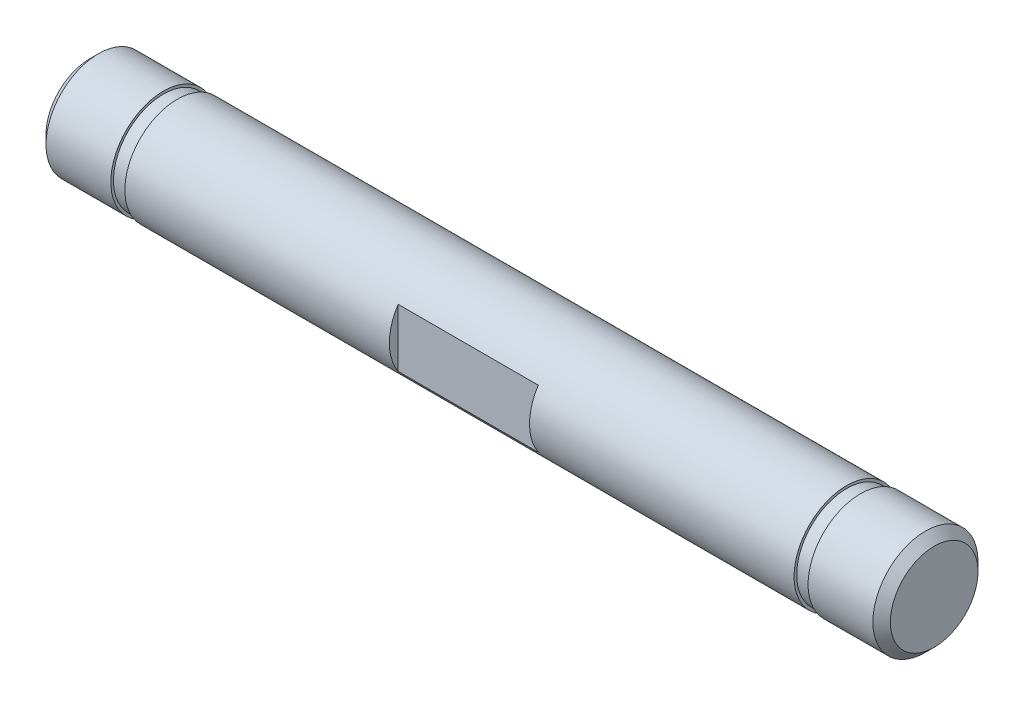
ISO-10303-21;
HEADER;
FILE_DESCRIPTION(('STEP AP214'),'2;1');
FILE_NAME('part.step','',(''),(''),'','','');
FILE_SCHEMA(('AUTOMOTIVE_DESIGN { 1 0 10303 214 1 1 1 1 }'));
ENDSEC;
DATA;
#1=APPLICATION_CONTEXT('core data for automotive mechanical design processes');
#2=APPLICATION_PROTOCOL_DEFINITION('international standard','automotive_design',2000,#1);
#3=PRODUCT_CONTEXT('',#1,'mechanical');
#4=PRODUCT('Part','Part','',(#3));
#5=PRODUCT_RELATED_PRODUCT_CATEGORY('part','',(#4));
#6=PRODUCT_DEFINITION_FORMATION('','',#4);
#7=PRODUCT_DEFINITION_CONTEXT('part definition',#1,'design');
#8=PRODUCT_DEFINITION('design','',#6,#7);
#9=PRODUCT_DEFINITION_SHAPE('','',#8);
#10=(LENGTH_UNIT() NAMED_UNIT(*) SI_UNIT(.MILLI.,.METRE.));
#11=(NAMED_UNIT(*) PLANE_ANGLE_UNIT() SI_UNIT($,.RADIAN.));
#12=(NAMED_UNIT(*) SI_UNIT($,.STERADIAN.) SOLID_ANGLE_UNIT());
#13=UNCERTAINTY_MEASURE_WITH_UNIT(LENGTH_MEASURE(1.E-05),#10,'distance_accuracy_value','');
#14=(GEOMETRIC_REPRESENTATION_CONTEXT(3) GLOBAL_UNCERTAINTY_ASSIGNED_CONTEXT((#13)) GLOBAL_UNIT_ASSIGNED_CONTEXT((#10,
#11,#12)) REPRESENTATION_CONTEXT('',''));
#15=CARTESIAN_POINT('',(0.,0.,0.));
#16=DIRECTION('',(0.,0.,1.));
#17=DIRECTION('',(1.,0.,0.));
#18=AXIS2_PLACEMENT_3D('',#15,#16,#17);
#19=CARTESIAN_POINT('',(24.1,0.,0.));
#20=DIRECTION('',(1.,0.,0.));
#21=DIRECTION('',(0.,0.,-1.));
#22=AXIS2_PLACEMENT_3D('',#19,#20,#21);
#23=CYLINDRICAL_SURFACE('',#22,3.);
#24=CARTESIAN_POINT('',(-19.1,0.,0.));
#25=DIRECTION('',(1.,0.,0.));
#26=DIRECTION('',(0.,0.,-1.));
#27=AXIS2_PLACEMENT_3D('',#24,#25,#26);
#28=CIRCLE('',#27,3.);
#29=CARTESIAN_POINT('',(-19.1,0.,-3.));
#30=VERTEX_POINT('',#29);
#31=EDGE_CURVE('E97',#30,#30,#28,.T.);
#32=ORIENTED_EDGE('',*,*,#31,.T.);
#33=EDGE_LOOP('',(#32));
#34=FACE_BOUND('',#33,.T.);
#35=CARTESIAN_POINT('',(19.1,0.,0.));
#36=DIRECTION('',(1.,0.,0.));
#37=DIRECTION('',(0.,0.,-1.));
#38=AXIS2_PLACEMENT_3D('',#35,#36,#37);
#39=CIRCLE('',#38,3.);
#40=CARTESIAN_POINT('',(19.1,0.,-3.));
#41=VERTEX_POINT('',#40);
#42=EDGE_CURVE('E100',#41,#41,#39,.T.);
#43=ORIENTED_EDGE('',*,*,#42,.F.);
#44=EDGE_LOOP('',(#43));
#45=FACE_BOUND('',#44,.T.);
#46=CARTESIAN_POINT('',(-4.,0.,0.));
#47=DIRECTION('',(1.,0.,0.));
#48=DIRECTION('',(0.,0.,-1.));
#49=AXIS2_PLACEMENT_3D('',#46,#47,#48);
#50=CIRCLE('',#49,3.);
#51=CARTESIAN_POINT('',(-4.,1.6583123951777,2.5));
#52=VERTEX_POINT('',#51);
#53=CARTESIAN_POINT('',(-4.,-1.6583123951777,2.5));
#54=VERTEX_POINT('',#53);
#55=EDGE_CURVE('E81',#52,#54,#50,.T.);
#56=ORIENTED_EDGE('',*,*,#55,.F.);
#57=DIRECTION('',(1.,0.,0.));
#58=VECTOR('',#57,1.);
#59=CARTESIAN_POINT('',(-4.,1.6583123951777,2.5));
#60=LINE('',#59,#58);
#61=CARTESIAN_POINT('',(4.,1.6583123951777,2.5));
#62=VERTEX_POINT('',#61);
#63=EDGE_CURVE('E68',#52,#62,#60,.T.);
#64=ORIENTED_EDGE('',*,*,#63,.T.);
#65=CARTESIAN_POINT('',(4.,0.,0.));
#66=DIRECTION('',(1.,0.,0.));
#67=DIRECTION('',(0.,0.,-1.));
#68=AXIS2_PLACEMENT_3D('',#65,#66,#67);
#69=CIRCLE('',#68,3.);
#70=CARTESIAN_POINT('',(4.,-1.6583123951777,2.5));
#71=VERTEX_POINT('',#70);
#72=EDGE_CURVE('E74',#62,#71,#69,.T.);
#73=ORIENTED_EDGE('',*,*,#72,.T.);
#74=DIRECTION('',(1.,0.,0.));
#75=VECTOR('',#74,1.);
#76=CARTESIAN_POINT('',(-4.,-1.6583123951777,2.5));
#77=LINE('',#76,#75);
#78=EDGE_CURVE('E80',#54,#71,#77,.T.);
#79=ORIENTED_EDGE('',*,*,#78,.F.);
#80=EDGE_LOOP('',(#56,#64,#73,#79));
#81=FACE_BOUND('',#80,.T.);
#82=ADVANCED_FACE('F45',(#34,#45,#81),#23,.T.);
#83=CARTESIAN_POINT('',(24.1,0.,3.));
#84=DIRECTION('',(-1.,0.,0.));
#85=DIRECTION('',(0.,0.,1.));
#86=AXIS2_PLACEMENT_3D('',#83,#84,#85);
#87=PLANE('',#86);
#88=CARTESIAN_POINT('',(24.1,0.,0.));
#89=DIRECTION('',(-1.,0.,0.));
#90=DIRECTION('',(0.,0.,1.));
#91=AXIS2_PLACEMENT_3D('',#88,#89,#90);
#92=CIRCLE('',#91,2.49999999999999);
#93=CARTESIAN_POINT('',(24.1,0.,2.49999999999999));
#94=VERTEX_POINT('',#93);
#95=EDGE_CURVE('E54',#94,#94,#92,.F.);
#96=ORIENTED_EDGE('',*,*,#95,.T.);
#97=EDGE_LOOP('',(#96));
#98=FACE_BOUND('',#97,.T.);
#99=ADVANCED_FACE('F120',(#98),#87,.F.);
#100=CARTESIAN_POINT('',(24.1,0.,0.));
#101=DIRECTION('',(1.,0.,0.));
#102=DIRECTION('',(0.,0.,-1.));
#103=AXIS2_PLACEMENT_3D('',#100,#101,#102);
#104=CYLINDRICAL_SURFACE('',#103,3.);
#105=CARTESIAN_POINT('',(23.6,0.,0.));
#106=DIRECTION('',(-1.,0.,0.));
#107=DIRECTION('',(0.,0.,1.));
#108=AXIS2_PLACEMENT_3D('',#105,#106,#107);
#109=CIRCLE('',#108,3.);
#110=CARTESIAN_POINT('',(23.6,0.,3.));
#111=VERTEX_POINT('',#110);
#112=EDGE_CURVE('E11',#111,#111,#109,.T.);
#113=ORIENTED_EDGE('',*,*,#112,.T.);
#114=EDGE_LOOP('',(#113));
#115=FACE_BOUND('',#114,.T.);
#116=CARTESIAN_POINT('',(19.9,0.,0.));
#117=DIRECTION('',(1.,0.,0.));
#118=DIRECTION('',(0.,0.,-1.));
#119=AXIS2_PLACEMENT_3D('',#116,#117,#118);
#120=CIRCLE('',#119,3.);
#121=CARTESIAN_POINT('',(19.9,0.,-3.));
#122=VERTEX_POINT('',#121);
#123=EDGE_CURVE('E109',#122,#122,#120,.T.);
#124=ORIENTED_EDGE('',*,*,#123,.T.);
#125=EDGE_LOOP('',(#124));
#126=FACE_BOUND('',#125,.T.);
#127=ADVANCED_FACE('F136',(#115,#126),#104,.T.);
#128=CARTESIAN_POINT('',(19.9,0.,2.85));
#129=DIRECTION('',(1.,0.,0.));
#130=DIRECTION('',(0.,0.,-1.));
#131=AXIS2_PLACEMENT_3D('',#128,#129,#130);
#132=PLANE('',#131);
#133=ORIENTED_EDGE('',*,*,#123,.F.);
#134=EDGE_LOOP('',(#133));
#135=FACE_BOUND('',#134,.T.);
#136=CARTESIAN_POINT('',(19.9,0.,0.));
#137=DIRECTION('',(1.,0.,0.));
#138=DIRECTION('',(0.,0.,-1.));
#139=AXIS2_PLACEMENT_3D('',#136,#137,#138);
#140=CIRCLE('',#139,2.85);
#141=CARTESIAN_POINT('',(19.9,0.,-2.85));
#142=VERTEX_POINT('',#141);
#143=EDGE_CURVE('E106',#142,#142,#140,.T.);
#144=ORIENTED_EDGE('',*,*,#143,.T.);
#145=EDGE_LOOP('',(#144));
#146=FACE_BOUND('',#145,.T.);
#147=ADVANCED_FACE('F150',(#135,#146),#132,.F.);
#148=CARTESIAN_POINT('',(24.1,0.,0.));
#149=DIRECTION('',(1.,0.,0.));
#150=DIRECTION('',(0.,0.,-1.));
#151=AXIS2_PLACEMENT_3D('',#148,#149,#150);
#152=CYLINDRICAL_SURFACE('',#151,2.85);
#153=ORIENTED_EDGE('',*,*,#143,.F.);
#154=EDGE_LOOP('',(#153));
#155=FACE_BOUND('',#154,.T.);
#156=CARTESIAN_POINT('',(19.1,0.,0.));
#157=DIRECTION('',(1.,0.,0.));
#158=DIRECTION('',(0.,0.,-1.));
#159=AXIS2_PLACEMENT_3D('',#156,#157,#158);
#160=CIRCLE('',#159,2.85);
#161=CARTESIAN_POINT('',(19.1,0.,-2.85));
#162=VERTEX_POINT('',#161);
#163=EDGE_CURVE('E103',#162,#162,#160,.T.);
#164=ORIENTED_EDGE('',*,*,#163,.T.);
#165=EDGE_LOOP('',(#164));
#166=FACE_BOUND('',#165,.T.);
#167=ADVANCED_FACE('F146',(#155,#166),#152,.T.);
#168=CARTESIAN_POINT('',(19.1,0.,3.));
#169=DIRECTION('',(-1.,0.,0.));
#170=DIRECTION('',(0.,0.,1.));
#171=AXIS2_PLACEMENT_3D('',#168,#169,#170);
#172=PLANE('',#171);
#173=ORIENTED_EDGE('',*,*,#163,.F.);
#174=EDGE_LOOP('',(#173));
#175=FACE_BOUND('',#174,.T.);
#176=ORIENTED_EDGE('',*,*,#42,.T.);
#177=EDGE_LOOP('',(#176));
#178=FACE_BOUND('',#177,.T.);
#179=ADVANCED_FACE('F143',(#175,#178),#172,.F.);
#180=CARTESIAN_POINT('',(-19.1,0.,3.));
#181=DIRECTION('',(1.,0.,0.));
#182=DIRECTION('',(0.,0.,-1.));
#183=AXIS2_PLACEMENT_3D('',#180,#181,#182);
#184=PLANE('',#183);
#185=ORIENTED_EDGE('',*,*,#31,.F.);
#186=EDGE_LOOP('',(#185));
#187=FACE_BOUND('',#186,.T.);
#188=CARTESIAN_POINT('',(-19.1,0.,0.));
#189=DIRECTION('',(1.,0.,0.));
#190=DIRECTION('',(0.,0.,-1.));
#191=AXIS2_PLACEMENT_3D('',#188,#189,#190);
#192=CIRCLE('',#191,2.85);
#193=CARTESIAN_POINT('',(-19.1,0.,-2.85));
#194=VERTEX_POINT('',#193);
#195=EDGE_CURVE('E94',#194,#194,#192,.T.);
#196=ORIENTED_EDGE('',*,*,#195,.T.);
#197=EDGE_LOOP('',(#196));
#198=FACE_BOUND('',#197,.T.);
#199=ADVANCED_FACE('F141',(#187,#198),#184,.F.);
#200=CARTESIAN_POINT('',(24.1,0.,0.));
#201=DIRECTION('',(1.,0.,0.));
#202=DIRECTION('',(0.,0.,-1.));
#203=AXIS2_PLACEMENT_3D('',#200,#201,#202);
#204=CYLINDRICAL_SURFACE('',#203,2.85);
#205=ORIENTED_EDGE('',*,*,#195,.F.);
#206=EDGE_LOOP('',(#205));
#207=FACE_BOUND('',#206,.T.);
#208=CARTESIAN_POINT('',(-19.9,0.,0.));
#209=DIRECTION('',(1.,0.,0.));
#210=DIRECTION('',(0.,0.,-1.));
#211=AXIS2_PLACEMENT_3D('',#208,#209,#210);
#212=CIRCLE('',#211,2.85);
#213=CARTESIAN_POINT('',(-19.9,0.,-2.85));
#214=VERTEX_POINT('',#213);
#215=EDGE_CURVE('E87',#214,#214,#212,.T.);
#216=ORIENTED_EDGE('',*,*,#215,.T.);
#217=EDGE_LOOP('',(#216));
#218=FACE_BOUND('',#217,.T.);
#219=ADVANCED_FACE('F246',(#207,#218),#204,.T.);
#220=CARTESIAN_POINT('',(-19.9,0.,2.85));
#221=DIRECTION('',(-1.,0.,0.));
#222=DIRECTION('',(0.,0.,1.));
#223=AXIS2_PLACEMENT_3D('',#220,#221,#222);
#224=PLANE('',#223);
#225=ORIENTED_EDGE('',*,*,#215,.F.);
#226=EDGE_LOOP('',(#225));
#227=FACE_BOUND('',#226,.T.);
#228=CARTESIAN_POINT('',(-19.9,0.,0.));
#229=DIRECTION('',(1.,0.,0.));
#230=DIRECTION('',(0.,0.,-1.));
#231=AXIS2_PLACEMENT_3D('',#228,#229,#230);
#232=CIRCLE('',#231,3.);
#233=CARTESIAN_POINT('',(-19.9,0.,-3.));
#234=VERTEX_POINT('',#233);
#235=EDGE_CURVE('E84',#234,#234,#232,.T.);
#236=ORIENTED_EDGE('',*,*,#235,.T.);
#237=EDGE_LOOP('',(#236));
#238=FACE_BOUND('',#237,.T.);
#239=ADVANCED_FACE('F185',(#227,#238),#224,.F.);
#240=CARTESIAN_POINT('',(24.1,0.,0.));
#241=DIRECTION('',(1.,0.,0.));
#242=DIRECTION('',(0.,0.,-1.));
#243=AXIS2_PLACEMENT_3D('',#240,#241,#242);
#244=CYLINDRICAL_SURFACE('',#243,3.);
#245=CARTESIAN_POINT('',(-23.6,0.,0.));
#246=DIRECTION('',(1.,0.,0.));
#247=DIRECTION('',(0.,0.,-1.));
#248=AXIS2_PLACEMENT_3D('',#245,#246,#247);
#249=CIRCLE('',#248,3.);
#250=CARTESIAN_POINT('',(-23.6,0.,-3.));
#251=VERTEX_POINT('',#250);
#252=EDGE_CURVE('E112',#251,#251,#249,.T.);
#253=ORIENTED_EDGE('',*,*,#252,.T.);
#254=EDGE_LOOP('',(#253));
#255=FACE_BOUND('',#254,.T.);
#256=ORIENTED_EDGE('',*,*,#235,.F.);
#257=EDGE_LOOP('',(#256));
#258=FACE_BOUND('',#257,.T.);
#259=ADVANCED_FACE('F180',(#255,#258),#244,.T.);
#260=CARTESIAN_POINT('',(-24.1,0.,3.));
#261=DIRECTION('',(1.,0.,0.));
#262=DIRECTION('',(0.,0.,-1.));
#263=AXIS2_PLACEMENT_3D('',#260,#261,#262);
#264=PLANE('',#263);
#265=CARTESIAN_POINT('',(-24.1,0.,0.));
#266=DIRECTION('',(1.,0.,0.));
#267=DIRECTION('',(0.,0.,-1.));
#268=AXIS2_PLACEMENT_3D('',#265,#266,#267);
#269=CIRCLE('',#268,2.5);
#270=CARTESIAN_POINT('',(-24.1,0.,-2.5));
#271=VERTEX_POINT('',#270);
#272=EDGE_CURVE('E115',#271,#271,#269,.F.);
#273=ORIENTED_EDGE('',*,*,#272,.T.);
#274=EDGE_LOOP('',(#273));
#275=FACE_BOUND('',#274,.T.);
#276=ADVANCED_FACE('F184',(#275),#264,.F.);
#277=CARTESIAN_POINT('',(-4.,1.6583123951777,2.5));
#278=DIRECTION('',(0.,0.,-1.));
#279=DIRECTION('',(-1.,0.,0.));
#280=AXIS2_PLACEMENT_3D('',#277,#278,#279);
#281=PLANE('',#280);
#282=DIRECTION('',(0.,1.,0.));
#283=VECTOR('',#282,1.);
#284=CARTESIAN_POINT('',(4.,1.6583123951777,2.5));
#285=LINE('',#284,#283);
#286=EDGE_CURVE('E60',#71,#62,#285,.T.);
#287=ORIENTED_EDGE('',*,*,#286,.T.);
#288=ORIENTED_EDGE('',*,*,#63,.F.);
#289=DIRECTION('',(0.,1.,0.));
#290=VECTOR('',#289,1.);
#291=CARTESIAN_POINT('',(-4.,1.6583123951777,2.5));
#292=LINE('',#291,#290);
#293=EDGE_CURVE('E89',#54,#52,#292,.T.);
#294=ORIENTED_EDGE('',*,*,#293,.F.);
#295=ORIENTED_EDGE('',*,*,#78,.T.);
#296=EDGE_LOOP('',(#287,#288,#294,#295));
#297=FACE_BOUND('',#296,.T.);
#298=ADVANCED_FACE('F79',(#297),#281,.F.);
#299=CARTESIAN_POINT('',(-4.,0.,0.));
#300=DIRECTION('',(1.,0.,0.));
#301=DIRECTION('',(0.,0.,-1.));
#302=AXIS2_PLACEMENT_3D('',#299,#300,#301);
#303=PLANE('',#302);
#304=ORIENTED_EDGE('',*,*,#55,.T.);
#305=ORIENTED_EDGE('',*,*,#293,.T.);
#306=EDGE_LOOP('',(#304,#305));
#307=FACE_BOUND('',#306,.T.);
#308=ADVANCED_FACE('F215',(#307),#303,.T.);
#309=CARTESIAN_POINT('',(4.,0.,0.));
#310=DIRECTION('',(1.,0.,0.));
#311=DIRECTION('',(0.,0.,-1.));
#312=AXIS2_PLACEMENT_3D('',#309,#310,#311);
#313=PLANE('',#312);
#314=ORIENTED_EDGE('',*,*,#72,.F.);
#315=ORIENTED_EDGE('',*,*,#286,.F.);
#316=EDGE_LOOP('',(#314,#315));
#317=FACE_BOUND('',#316,.T.);
#318=ADVANCED_FACE('F75',(#317),#313,.F.);
#319=CARTESIAN_POINT('',(-23.6,0.,0.));
#320=DIRECTION('',(1.,0.,0.));
#321=DIRECTION('',(0.,0.,-1.));
#322=AXIS2_PLACEMENT_3D('',#319,#320,#321);
#323=CONICAL_SURFACE('',#322,3.,0.785398163397453);
#324=ORIENTED_EDGE('',*,*,#272,.F.);
#325=EDGE_LOOP('',(#324));
#326=FACE_BOUND('',#325,.T.);
#327=ORIENTED_EDGE('',*,*,#252,.F.);
#328=EDGE_LOOP('',(#327));
#329=FACE_BOUND('',#328,.T.);
#330=ADVANCED_FACE('F123',(#326,#329),#323,.T.);
#331=CARTESIAN_POINT('',(24.1,0.,0.));
#332=DIRECTION('',(-1.,0.,0.));
#333=DIRECTION('',(0.,0.,1.));
#334=AXIS2_PLACEMENT_3D('',#331,#332,#333);
#335=CONICAL_SURFACE('',#334,2.49999999999999,0.785398163397453);
#336=ORIENTED_EDGE('',*,*,#112,.F.);
#337=EDGE_LOOP('',(#336));
#338=FACE_BOUND('',#337,.T.);
#339=ORIENTED_EDGE('',*,*,#95,.F.);
#340=EDGE_LOOP('',(#339));
#341=FACE_BOUND('',#340,.T.);
#342=ADVANCED_FACE('F48',(#338,#341),#335,.T.);
#343=CLOSED_SHELL('',(#82,#99,#127,#147,#167,#179,#199,#219,#239,#259,#276,#298,#308,#318,#330,#342));
#344=MANIFOLD_SOLID_BREP('B2',#343);
#345=ADVANCED_BREP_SHAPE_REPRESENTATION('',(#18,#344),#14);
#346=SHAPE_DEFINITION_REPRESENTATION(#9,#345);
ENDSEC;
END-ISO-10303-21;
